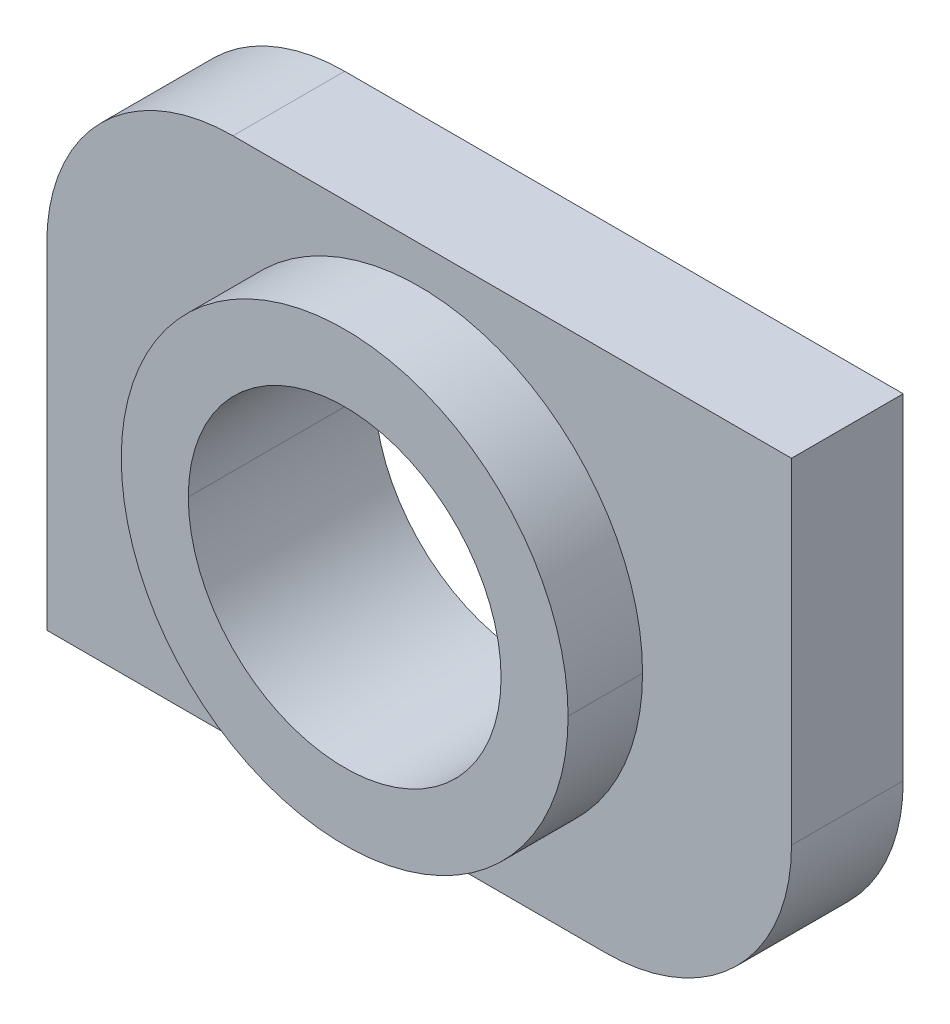
ISO-10303-21;
HEADER;
FILE_DESCRIPTION(('STEP AP214'),'2;1');
FILE_NAME('part.step','',(''),(''),'','','');
FILE_SCHEMA(('AUTOMOTIVE_DESIGN { 1 0 10303 214 1 1 1 1 }'));
ENDSEC;
DATA;
#1=APPLICATION_CONTEXT('core data for automotive mechanical design processes');
#2=APPLICATION_PROTOCOL_DEFINITION('international standard','automotive_design',2000,#1);
#3=PRODUCT_CONTEXT('',#1,'mechanical');
#4=PRODUCT('Part','Part','',(#3));
#5=PRODUCT_RELATED_PRODUCT_CATEGORY('part','',(#4));
#6=PRODUCT_DEFINITION_FORMATION('','',#4);
#7=PRODUCT_DEFINITION_CONTEXT('part definition',#1,'design');
#8=PRODUCT_DEFINITION('design','',#6,#7);
#9=PRODUCT_DEFINITION_SHAPE('','',#8);
#10=(LENGTH_UNIT() NAMED_UNIT(*) SI_UNIT(.MILLI.,.METRE.));
#11=(NAMED_UNIT(*) PLANE_ANGLE_UNIT() SI_UNIT($,.RADIAN.));
#12=(NAMED_UNIT(*) SI_UNIT($,.STERADIAN.) SOLID_ANGLE_UNIT());
#13=UNCERTAINTY_MEASURE_WITH_UNIT(LENGTH_MEASURE(1.E-05),#10,'distance_accuracy_value','');
#14=(GEOMETRIC_REPRESENTATION_CONTEXT(3) GLOBAL_UNCERTAINTY_ASSIGNED_CONTEXT((#13)) GLOBAL_UNIT_ASSIGNED_CONTEXT((#10,
#11,#12)) REPRESENTATION_CONTEXT('',''));
#15=CARTESIAN_POINT('',(0.,0.,0.));
#16=DIRECTION('',(0.,0.,1.));
#17=DIRECTION('',(1.,0.,0.));
#18=AXIS2_PLACEMENT_3D('',#15,#16,#17);
#19=CARTESIAN_POINT('',(0.,0.,2.5));
#20=DIRECTION('',(0.,0.,-1.));
#21=DIRECTION('',(-1.,0.,0.));
#22=AXIS2_PLACEMENT_3D('',#19,#20,#21);
#23=CYLINDRICAL_SURFACE('',#22,3.);
#24=CARTESIAN_POINT('',(0.,0.,1.5));
#25=DIRECTION('',(0.,0.,-1.));
#26=DIRECTION('',(-1.,0.,0.));
#27=AXIS2_PLACEMENT_3D('',#24,#25,#26);
#28=CIRCLE('',#27,3.);
#29=CARTESIAN_POINT('',(-3.,0.,1.5));
#30=VERTEX_POINT('',#29);
#31=CARTESIAN_POINT('',(3.,0.,1.5));
#32=VERTEX_POINT('',#31);
#33=EDGE_CURVE('E103',#30,#32,#28,.T.);
#34=ORIENTED_EDGE('',*,*,#33,.F.);
#35=DIRECTION('',(0.,0.,-1.));
#36=VECTOR('',#35,1.);
#37=CARTESIAN_POINT('',(-3.,0.,2.5));
#38=LINE('',#37,#36);
#39=CARTESIAN_POINT('',(-3.,0.,2.5));
#40=VERTEX_POINT('',#39);
#41=EDGE_CURVE('E86',#40,#30,#38,.T.);
#42=ORIENTED_EDGE('',*,*,#41,.F.);
#43=CARTESIAN_POINT('',(0.,0.,2.5));
#44=DIRECTION('',(0.,0.,-1.));
#45=DIRECTION('',(-1.,0.,0.));
#46=AXIS2_PLACEMENT_3D('',#43,#44,#45);
#47=CIRCLE('',#46,3.);
#48=CARTESIAN_POINT('',(3.,0.,2.5));
#49=VERTEX_POINT('',#48);
#50=EDGE_CURVE('E102',#49,#40,#47,.F.);
#51=ORIENTED_EDGE('',*,*,#50,.F.);
#52=DIRECTION('',(0.,0.,-1.));
#53=VECTOR('',#52,1.);
#54=CARTESIAN_POINT('',(3.,0.,2.5));
#55=LINE('',#54,#53);
#56=EDGE_CURVE('E93',#32,#49,#55,.F.);
#57=ORIENTED_EDGE('',*,*,#56,.F.);
#58=EDGE_LOOP('',(#34,#42,#51,#57));
#59=FACE_BOUND('',#58,.T.);
#60=ADVANCED_FACE('F17',(#59),#23,.T.);
#61=CARTESIAN_POINT('',(0.,0.,2.5));
#62=DIRECTION('',(0.,0.,-1.));
#63=DIRECTION('',(-1.,0.,0.));
#64=AXIS2_PLACEMENT_3D('',#61,#62,#63);
#65=CYLINDRICAL_SURFACE('',#64,3.);
#66=ORIENTED_EDGE('',*,*,#41,.T.);
#67=CARTESIAN_POINT('',(0.,0.,1.5));
#68=DIRECTION('',(0.,0.,-1.));
#69=DIRECTION('',(-1.,0.,0.));
#70=AXIS2_PLACEMENT_3D('',#67,#68,#69);
#71=CIRCLE('',#70,3.);
#72=EDGE_CURVE('E97',#32,#30,#71,.T.);
#73=ORIENTED_EDGE('',*,*,#72,.F.);
#74=ORIENTED_EDGE('',*,*,#56,.T.);
#75=CARTESIAN_POINT('',(0.,0.,2.5));
#76=DIRECTION('',(0.,0.,-1.));
#77=DIRECTION('',(-1.,0.,0.));
#78=AXIS2_PLACEMENT_3D('',#75,#76,#77);
#79=CIRCLE('',#78,3.);
#80=EDGE_CURVE('E20',#40,#49,#79,.F.);
#81=ORIENTED_EDGE('',*,*,#80,.F.);
#82=EDGE_LOOP('',(#66,#73,#74,#81));
#83=FACE_BOUND('',#82,.T.);
#84=ADVANCED_FACE('F95',(#83),#65,.T.);
#85=CARTESIAN_POINT('',(0.,0.,2.5));
#86=DIRECTION('',(0.,0.,1.));
#87=DIRECTION('',(1.,0.,0.));
#88=AXIS2_PLACEMENT_3D('',#85,#86,#87);
#89=PLANE('',#88);
#90=ORIENTED_EDGE('',*,*,#80,.T.);
#91=ORIENTED_EDGE('',*,*,#50,.T.);
#92=EDGE_LOOP('',(#90,#91));
#93=FACE_BOUND('',#92,.T.);
#94=CARTESIAN_POINT('',(0.,0.,2.5));
#95=DIRECTION('',(0.,0.,-1.));
#96=DIRECTION('',(-1.,0.,0.));
#97=AXIS2_PLACEMENT_3D('',#94,#95,#96);
#98=CIRCLE('',#97,2.1);
#99=CARTESIAN_POINT('',(-2.1,0.,2.5));
#100=VERTEX_POINT('',#99);
#101=CARTESIAN_POINT('',(2.1,0.,2.5));
#102=VERTEX_POINT('',#101);
#103=EDGE_CURVE('E110',#100,#102,#98,.T.);
#104=ORIENTED_EDGE('',*,*,#103,.T.);
#105=CARTESIAN_POINT('',(0.,0.,2.5));
#106=DIRECTION('',(0.,0.,-1.));
#107=DIRECTION('',(-1.,0.,0.));
#108=AXIS2_PLACEMENT_3D('',#105,#106,#107);
#109=CIRCLE('',#108,2.1);
#110=EDGE_CURVE('E107',#102,#100,#109,.T.);
#111=ORIENTED_EDGE('',*,*,#110,.T.);
#112=EDGE_LOOP('',(#104,#111));
#113=FACE_BOUND('',#112,.T.);
#114=ADVANCED_FACE('F100',(#93,#113),#89,.T.);
#115=CARTESIAN_POINT('',(-5.,-3.5,1.5));
#116=DIRECTION('',(0.,0.,1.));
#117=DIRECTION('',(1.,0.,0.));
#118=AXIS2_PLACEMENT_3D('',#115,#116,#117);
#119=PLANE('',#118);
#120=DIRECTION('',(0.,-1.,0.));
#121=VECTOR('',#120,1.);
#122=CARTESIAN_POINT('',(5.,3.5,1.5));
#123=LINE('',#122,#121);
#124=CARTESIAN_POINT('',(5.,-0.999999999999999,1.5));
#125=VERTEX_POINT('',#124);
#126=CARTESIAN_POINT('',(5.,3.5,1.5));
#127=VERTEX_POINT('',#126);
#128=EDGE_CURVE('E147',#125,#127,#123,.F.);
#129=ORIENTED_EDGE('',*,*,#128,.T.);
#130=DIRECTION('',(1.,0.,0.));
#131=VECTOR('',#130,1.);
#132=CARTESIAN_POINT('',(-5.,3.5,1.5));
#133=LINE('',#132,#131);
#134=CARTESIAN_POINT('',(-2.5,3.5,1.5));
#135=VERTEX_POINT('',#134);
#136=EDGE_CURVE('E117',#127,#135,#133,.F.);
#137=ORIENTED_EDGE('',*,*,#136,.T.);
#138=CARTESIAN_POINT('',(-2.5,1.,1.5));
#139=DIRECTION('',(0.,0.,-1.));
#140=DIRECTION('',(-1.,0.,0.));
#141=AXIS2_PLACEMENT_3D('',#138,#139,#140);
#142=CIRCLE('',#141,2.5);
#143=CARTESIAN_POINT('',(-5.,1.,1.5));
#144=VERTEX_POINT('',#143);
#145=EDGE_CURVE('E114',#144,#135,#142,.T.);
#146=ORIENTED_EDGE('',*,*,#145,.F.);
#147=DIRECTION('',(0.,1.,0.));
#148=VECTOR('',#147,1.);
#149=CARTESIAN_POINT('',(-5.,3.5,1.5));
#150=LINE('',#149,#148);
#151=CARTESIAN_POINT('',(-5.,-3.5,1.5));
#152=VERTEX_POINT('',#151);
#153=EDGE_CURVE('E141',#144,#152,#150,.F.);
#154=ORIENTED_EDGE('',*,*,#153,.T.);
#155=DIRECTION('',(-1.,0.,0.));
#156=VECTOR('',#155,1.);
#157=CARTESIAN_POINT('',(-5.,-3.5,1.5));
#158=LINE('',#157,#156);
#159=CARTESIAN_POINT('',(2.5,-3.5,1.5));
#160=VERTEX_POINT('',#159);
#161=EDGE_CURVE('E152',#152,#160,#158,.F.);
#162=ORIENTED_EDGE('',*,*,#161,.T.);
#163=CARTESIAN_POINT('',(2.5,-0.999999999999999,1.5));
#164=DIRECTION('',(0.,0.,-1.));
#165=DIRECTION('',(-1.,0.,0.));
#166=AXIS2_PLACEMENT_3D('',#163,#164,#165);
#167=CIRCLE('',#166,2.5);
#168=EDGE_CURVE('E118',#125,#160,#167,.T.);
#169=ORIENTED_EDGE('',*,*,#168,.F.);
#170=EDGE_LOOP('',(#129,#137,#146,#154,#162,#169));
#171=FACE_BOUND('',#170,.T.);
#172=ORIENTED_EDGE('',*,*,#33,.T.);
#173=ORIENTED_EDGE('',*,*,#72,.T.);
#174=EDGE_LOOP('',(#172,#173));
#175=FACE_BOUND('',#174,.T.);
#176=ADVANCED_FACE('F214',(#171,#175),#119,.T.);
#177=CARTESIAN_POINT('',(0.,0.,1.5));
#178=DIRECTION('',(0.,0.,-1.));
#179=DIRECTION('',(-1.,0.,0.));
#180=AXIS2_PLACEMENT_3D('',#177,#178,#179);
#181=CYLINDRICAL_SURFACE('',#180,2.1);
#182=DIRECTION('',(0.,0.,-1.));
#183=VECTOR('',#182,1.);
#184=CARTESIAN_POINT('',(2.1,0.,1.5));
#185=LINE('',#184,#183);
#186=CARTESIAN_POINT('',(2.1,0.,0.));
#187=VERTEX_POINT('',#186);
#188=EDGE_CURVE('E113',#102,#187,#185,.T.);
#189=ORIENTED_EDGE('',*,*,#188,.T.);
#190=CARTESIAN_POINT('',(0.,0.,0.));
#191=DIRECTION('',(0.,0.,-1.));
#192=DIRECTION('',(-1.,0.,0.));
#193=AXIS2_PLACEMENT_3D('',#190,#191,#192);
#194=CIRCLE('',#193,2.1);
#195=CARTESIAN_POINT('',(-2.1,0.,0.));
#196=VERTEX_POINT('',#195);
#197=EDGE_CURVE('E121',#187,#196,#194,.T.);
#198=ORIENTED_EDGE('',*,*,#197,.T.);
#199=DIRECTION('',(0.,0.,-1.));
#200=VECTOR('',#199,1.);
#201=CARTESIAN_POINT('',(-2.1,0.,1.5));
#202=LINE('',#201,#200);
#203=EDGE_CURVE('E109',#196,#100,#202,.F.);
#204=ORIENTED_EDGE('',*,*,#203,.T.);
#205=ORIENTED_EDGE('',*,*,#110,.F.);
#206=EDGE_LOOP('',(#189,#198,#204,#205));
#207=FACE_BOUND('',#206,.T.);
#208=ADVANCED_FACE('F238',(#207),#181,.F.);
#209=CARTESIAN_POINT('',(0.,0.,1.5));
#210=DIRECTION('',(0.,0.,-1.));
#211=DIRECTION('',(-1.,0.,0.));
#212=AXIS2_PLACEMENT_3D('',#209,#210,#211);
#213=CYLINDRICAL_SURFACE('',#212,2.1);
#214=ORIENTED_EDGE('',*,*,#103,.F.);
#215=ORIENTED_EDGE('',*,*,#203,.F.);
#216=CARTESIAN_POINT('',(0.,0.,0.));
#217=DIRECTION('',(0.,0.,-1.));
#218=DIRECTION('',(-1.,0.,0.));
#219=AXIS2_PLACEMENT_3D('',#216,#217,#218);
#220=CIRCLE('',#219,2.1);
#221=EDGE_CURVE('E124',#196,#187,#220,.T.);
#222=ORIENTED_EDGE('',*,*,#221,.T.);
#223=ORIENTED_EDGE('',*,*,#188,.F.);
#224=EDGE_LOOP('',(#214,#215,#222,#223));
#225=FACE_BOUND('',#224,.T.);
#226=ADVANCED_FACE('F235',(#225),#213,.F.);
#227=CARTESIAN_POINT('',(5.,3.5,1.5));
#228=DIRECTION('',(-1.,0.,0.));
#229=DIRECTION('',(0.,-1.,0.));
#230=AXIS2_PLACEMENT_3D('',#227,#228,#229);
#231=PLANE('',#230);
#232=DIRECTION('',(0.,1.,0.));
#233=VECTOR('',#232,1.);
#234=CARTESIAN_POINT('',(5.,-3.5,0.));
#235=LINE('',#234,#233);
#236=CARTESIAN_POINT('',(5.,-0.999999999999999,0.));
#237=VERTEX_POINT('',#236);
#238=CARTESIAN_POINT('',(5.,3.5,0.));
#239=VERTEX_POINT('',#238);
#240=EDGE_CURVE('E127',#237,#239,#235,.T.);
#241=ORIENTED_EDGE('',*,*,#240,.T.);
#242=DIRECTION('',(0.,0.,-1.));
#243=VECTOR('',#242,1.);
#244=CARTESIAN_POINT('',(5.,3.5,1.5));
#245=LINE('',#244,#243);
#246=EDGE_CURVE('E138',#239,#127,#245,.F.);
#247=ORIENTED_EDGE('',*,*,#246,.T.);
#248=ORIENTED_EDGE('',*,*,#128,.F.);
#249=DIRECTION('',(0.,0.,-1.));
#250=VECTOR('',#249,1.);
#251=CARTESIAN_POINT('',(5.,-0.999999999999999,1.5));
#252=LINE('',#251,#250);
#253=EDGE_CURVE('E120',#237,#125,#252,.F.);
#254=ORIENTED_EDGE('',*,*,#253,.F.);
#255=EDGE_LOOP('',(#241,#247,#248,#254));
#256=FACE_BOUND('',#255,.T.);
#257=ADVANCED_FACE('F210',(#256),#231,.F.);
#258=CARTESIAN_POINT('',(-5.,3.5,1.5));
#259=DIRECTION('',(0.,-1.,0.));
#260=DIRECTION('',(0.,0.,-1.));
#261=AXIS2_PLACEMENT_3D('',#258,#259,#260);
#262=PLANE('',#261);
#263=ORIENTED_EDGE('',*,*,#136,.F.);
#264=ORIENTED_EDGE('',*,*,#246,.F.);
#265=DIRECTION('',(1.,0.,0.));
#266=VECTOR('',#265,1.);
#267=CARTESIAN_POINT('',(-5.,3.5,0.));
#268=LINE('',#267,#266);
#269=CARTESIAN_POINT('',(-2.5,3.5,0.));
#270=VERTEX_POINT('',#269);
#271=EDGE_CURVE('E131',#239,#270,#268,.F.);
#272=ORIENTED_EDGE('',*,*,#271,.T.);
#273=DIRECTION('',(0.,0.,-1.));
#274=VECTOR('',#273,1.);
#275=CARTESIAN_POINT('',(-2.5,3.5,1.5));
#276=LINE('',#275,#274);
#277=EDGE_CURVE('E116',#135,#270,#276,.T.);
#278=ORIENTED_EDGE('',*,*,#277,.F.);
#279=EDGE_LOOP('',(#263,#264,#272,#278));
#280=FACE_BOUND('',#279,.T.);
#281=ADVANCED_FACE('F208',(#280),#262,.F.);
#282=CARTESIAN_POINT('',(-2.5,1.,1.5));
#283=DIRECTION('',(0.,0.,-1.));
#284=DIRECTION('',(-1.,0.,0.));
#285=AXIS2_PLACEMENT_3D('',#282,#283,#284);
#286=CYLINDRICAL_SURFACE('',#285,2.5);
#287=ORIENTED_EDGE('',*,*,#145,.T.);
#288=ORIENTED_EDGE('',*,*,#277,.T.);
#289=CARTESIAN_POINT('',(-2.5,1.,0.));
#290=DIRECTION('',(0.,0.,-1.));
#291=DIRECTION('',(-1.,0.,0.));
#292=AXIS2_PLACEMENT_3D('',#289,#290,#291);
#293=CIRCLE('',#292,2.5);
#294=CARTESIAN_POINT('',(-5.,1.,0.));
#295=VERTEX_POINT('',#294);
#296=EDGE_CURVE('E128',#270,#295,#293,.F.);
#297=ORIENTED_EDGE('',*,*,#296,.T.);
#298=DIRECTION('',(0.,0.,1.));
#299=VECTOR('',#298,1.);
#300=CARTESIAN_POINT('',(-5.,1.,1.5));
#301=LINE('',#300,#299);
#302=EDGE_CURVE('E144',#295,#144,#301,.T.);
#303=ORIENTED_EDGE('',*,*,#302,.T.);
#304=EDGE_LOOP('',(#287,#288,#297,#303));
#305=FACE_BOUND('',#304,.T.);
#306=ADVANCED_FACE('F202',(#305),#286,.T.);
#307=CARTESIAN_POINT('',(-5.,3.5,1.5));
#308=DIRECTION('',(1.,0.,0.));
#309=DIRECTION('',(0.,1.,0.));
#310=AXIS2_PLACEMENT_3D('',#307,#308,#309);
#311=PLANE('',#310);
#312=DIRECTION('',(0.,1.,0.));
#313=VECTOR('',#312,1.);
#314=CARTESIAN_POINT('',(-5.,-3.5,0.));
#315=LINE('',#314,#313);
#316=CARTESIAN_POINT('',(-5.,-3.5,0.));
#317=VERTEX_POINT('',#316);
#318=EDGE_CURVE('E130',#295,#317,#315,.F.);
#319=ORIENTED_EDGE('',*,*,#318,.T.);
#320=DIRECTION('',(0.,0.,1.));
#321=VECTOR('',#320,1.);
#322=CARTESIAN_POINT('',(-5.,-3.5,1.5));
#323=LINE('',#322,#321);
#324=EDGE_CURVE('E155',#317,#152,#323,.T.);
#325=ORIENTED_EDGE('',*,*,#324,.T.);
#326=ORIENTED_EDGE('',*,*,#153,.F.);
#327=ORIENTED_EDGE('',*,*,#302,.F.);
#328=EDGE_LOOP('',(#319,#325,#326,#327));
#329=FACE_BOUND('',#328,.T.);
#330=ADVANCED_FACE('F199',(#329),#311,.F.);
#331=CARTESIAN_POINT('',(-5.,-3.5,1.5));
#332=DIRECTION('',(0.,1.,0.));
#333=DIRECTION('',(-1.,0.,0.));
#334=AXIS2_PLACEMENT_3D('',#331,#332,#333);
#335=PLANE('',#334);
#336=ORIENTED_EDGE('',*,*,#161,.F.);
#337=ORIENTED_EDGE('',*,*,#324,.F.);
#338=DIRECTION('',(1.,0.,0.));
#339=VECTOR('',#338,1.);
#340=CARTESIAN_POINT('',(-5.,-3.5,0.));
#341=LINE('',#340,#339);
#342=CARTESIAN_POINT('',(2.5,-3.5,0.));
#343=VERTEX_POINT('',#342);
#344=EDGE_CURVE('E26',#317,#343,#341,.T.);
#345=ORIENTED_EDGE('',*,*,#344,.T.);
#346=DIRECTION('',(0.,0.,-1.));
#347=VECTOR('',#346,1.);
#348=CARTESIAN_POINT('',(2.5,-3.5,1.5));
#349=LINE('',#348,#347);
#350=EDGE_CURVE('E34',#160,#343,#349,.T.);
#351=ORIENTED_EDGE('',*,*,#350,.F.);
#352=EDGE_LOOP('',(#336,#337,#345,#351));
#353=FACE_BOUND('',#352,.T.);
#354=ADVANCED_FACE('F192',(#353),#335,.F.);
#355=CARTESIAN_POINT('',(2.5,-0.999999999999999,1.5));
#356=DIRECTION('',(0.,0.,-1.));
#357=DIRECTION('',(-1.,0.,0.));
#358=AXIS2_PLACEMENT_3D('',#355,#356,#357);
#359=CYLINDRICAL_SURFACE('',#358,2.5);
#360=ORIENTED_EDGE('',*,*,#168,.T.);
#361=ORIENTED_EDGE('',*,*,#350,.T.);
#362=CARTESIAN_POINT('',(2.5,-0.999999999999999,0.));
#363=DIRECTION('',(0.,0.,-1.));
#364=DIRECTION('',(-1.,0.,0.));
#365=AXIS2_PLACEMENT_3D('',#362,#363,#364);
#366=CIRCLE('',#365,2.5);
#367=EDGE_CURVE('E11',#343,#237,#366,.F.);
#368=ORIENTED_EDGE('',*,*,#367,.T.);
#369=ORIENTED_EDGE('',*,*,#253,.T.);
#370=EDGE_LOOP('',(#360,#361,#368,#369));
#371=FACE_BOUND('',#370,.T.);
#372=ADVANCED_FACE('F216',(#371),#359,.T.);
#373=CARTESIAN_POINT('',(-5.,-3.5,0.));
#374=DIRECTION('',(0.,0.,1.));
#375=DIRECTION('',(1.,0.,0.));
#376=AXIS2_PLACEMENT_3D('',#373,#374,#375);
#377=PLANE('',#376);
#378=ORIENTED_EDGE('',*,*,#344,.F.);
#379=ORIENTED_EDGE('',*,*,#318,.F.);
#380=ORIENTED_EDGE('',*,*,#296,.F.);
#381=ORIENTED_EDGE('',*,*,#271,.F.);
#382=ORIENTED_EDGE('',*,*,#240,.F.);
#383=ORIENTED_EDGE('',*,*,#367,.F.);
#384=EDGE_LOOP('',(#378,#379,#380,#381,#382,#383));
#385=FACE_BOUND('',#384,.T.);
#386=ORIENTED_EDGE('',*,*,#197,.F.);
#387=ORIENTED_EDGE('',*,*,#221,.F.);
#388=EDGE_LOOP('',(#386,#387));
#389=FACE_BOUND('',#388,.T.);
#390=ADVANCED_FACE('F195',(#385,#389),#377,.F.);
#391=CLOSED_SHELL('',(#60,#84,#114,#176,#208,#226,#257,#281,#306,#330,#354,#372,#390));
#392=MANIFOLD_SOLID_BREP('B1',#391);
#393=ADVANCED_BREP_SHAPE_REPRESENTATION('',(#18,#392),#14);
#394=SHAPE_DEFINITION_REPRESENTATION(#9,#393);
ENDSEC;
END-ISO-10303-21;
